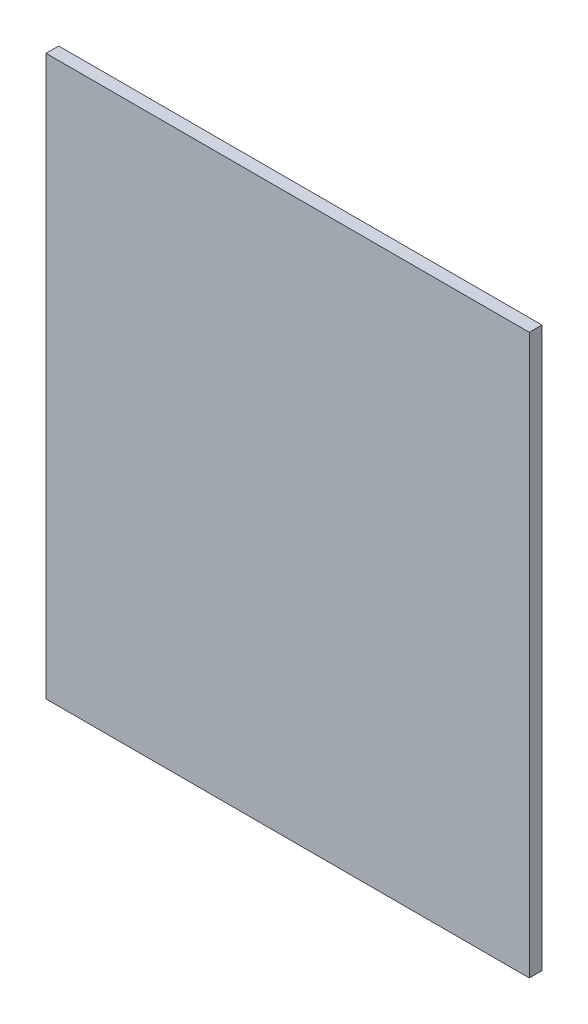
ISO-10303-21;
HEADER;
FILE_DESCRIPTION(('STEP AP214'),'2;1');
FILE_NAME('part.step','',(''),(''),'','','');
FILE_SCHEMA(('AUTOMOTIVE_DESIGN { 1 0 10303 214 1 1 1 1 }'));
ENDSEC;
DATA;
#1=APPLICATION_CONTEXT('core data for automotive mechanical design processes');
#2=APPLICATION_PROTOCOL_DEFINITION('international standard','automotive_design',2000,#1);
#3=PRODUCT_CONTEXT('',#1,'mechanical');
#4=PRODUCT('Part','Part','',(#3));
#5=PRODUCT_RELATED_PRODUCT_CATEGORY('part','',(#4));
#6=PRODUCT_DEFINITION_FORMATION('','',#4);
#7=PRODUCT_DEFINITION_CONTEXT('part definition',#1,'design');
#8=PRODUCT_DEFINITION('design','',#6,#7);
#9=PRODUCT_DEFINITION_SHAPE('','',#8);
#10=(LENGTH_UNIT() NAMED_UNIT(*) SI_UNIT(.MILLI.,.METRE.));
#11=(NAMED_UNIT(*) PLANE_ANGLE_UNIT() SI_UNIT($,.RADIAN.));
#12=(NAMED_UNIT(*) SI_UNIT($,.STERADIAN.) SOLID_ANGLE_UNIT());
#13=UNCERTAINTY_MEASURE_WITH_UNIT(LENGTH_MEASURE(1.E-05),#10,'distance_accuracy_value','');
#14=(GEOMETRIC_REPRESENTATION_CONTEXT(3) GLOBAL_UNCERTAINTY_ASSIGNED_CONTEXT((#13)) GLOBAL_UNIT_ASSIGNED_CONTEXT((#10,
#11,#12)) REPRESENTATION_CONTEXT('',''));
#15=CARTESIAN_POINT('',(0.,0.,0.));
#16=DIRECTION('',(0.,0.,1.));
#17=DIRECTION('',(1.,0.,0.));
#18=AXIS2_PLACEMENT_3D('',#15,#16,#17);
#19=CARTESIAN_POINT('',(95.5,-110.5,5.));
#20=DIRECTION('',(-1.,0.,0.));
#21=DIRECTION('',(0.,0.,1.));
#22=AXIS2_PLACEMENT_3D('',#19,#20,#21);
#23=PLANE('',#22);
#24=DIRECTION('',(0.,1.,0.));
#25=VECTOR('',#24,1.);
#26=CARTESIAN_POINT('',(95.5,-110.5,0.));
#27=LINE('',#26,#25);
#28=CARTESIAN_POINT('',(95.5,-110.5,0.));
#29=VERTEX_POINT('',#28);
#30=CARTESIAN_POINT('',(95.5,110.5,0.));
#31=VERTEX_POINT('',#30);
#32=EDGE_CURVE('E111',#29,#31,#27,.T.);
#33=ORIENTED_EDGE('',*,*,#32,.T.);
#34=DIRECTION('',(0.,0.,-1.));
#35=VECTOR('',#34,1.);
#36=CARTESIAN_POINT('',(95.5,110.5,5.));
#37=LINE('',#36,#35);
#38=CARTESIAN_POINT('',(95.5,110.5,5.));
#39=VERTEX_POINT('',#38);
#40=EDGE_CURVE('E11',#39,#31,#37,.T.);
#41=ORIENTED_EDGE('',*,*,#40,.F.);
#42=DIRECTION('',(0.,1.,0.));
#43=VECTOR('',#42,1.);
#44=CARTESIAN_POINT('',(95.5,-110.5,5.));
#45=LINE('',#44,#43);
#46=CARTESIAN_POINT('',(95.5,-110.5,5.));
#47=VERTEX_POINT('',#46);
#48=EDGE_CURVE('E95',#47,#39,#45,.T.);
#49=ORIENTED_EDGE('',*,*,#48,.F.);
#50=DIRECTION('',(0.,0.,-1.));
#51=VECTOR('',#50,1.);
#52=CARTESIAN_POINT('',(95.5,-110.5,5.));
#53=LINE('',#52,#51);
#54=EDGE_CURVE('E107',#47,#29,#53,.T.);
#55=ORIENTED_EDGE('',*,*,#54,.T.);
#56=EDGE_LOOP('',(#33,#41,#49,#55));
#57=FACE_BOUND('',#56,.T.);
#58=ADVANCED_FACE('F43',(#57),#23,.F.);
#59=CARTESIAN_POINT('',(-95.5,110.5,5.));
#60=DIRECTION('',(0.,-1.,0.));
#61=DIRECTION('',(0.,0.,-1.));
#62=AXIS2_PLACEMENT_3D('',#59,#60,#61);
#63=PLANE('',#62);
#64=DIRECTION('',(-1.,0.,0.));
#65=VECTOR('',#64,1.);
#66=CARTESIAN_POINT('',(-95.5,110.5,0.));
#67=LINE('',#66,#65);
#68=CARTESIAN_POINT('',(-95.5,110.5,0.));
#69=VERTEX_POINT('',#68);
#70=EDGE_CURVE('E100',#31,#69,#67,.T.);
#71=ORIENTED_EDGE('',*,*,#70,.T.);
#72=DIRECTION('',(0.,0.,-1.));
#73=VECTOR('',#72,1.);
#74=CARTESIAN_POINT('',(-95.5,110.5,5.));
#75=LINE('',#74,#73);
#76=CARTESIAN_POINT('',(-95.5,110.5,5.));
#77=VERTEX_POINT('',#76);
#78=EDGE_CURVE('E52',#77,#69,#75,.T.);
#79=ORIENTED_EDGE('',*,*,#78,.F.);
#80=DIRECTION('',(-1.,0.,0.));
#81=VECTOR('',#80,1.);
#82=CARTESIAN_POINT('',(-95.5,110.5,5.));
#83=LINE('',#82,#81);
#84=EDGE_CURVE('E90',#39,#77,#83,.T.);
#85=ORIENTED_EDGE('',*,*,#84,.F.);
#86=ORIENTED_EDGE('',*,*,#40,.T.);
#87=EDGE_LOOP('',(#71,#79,#85,#86));
#88=FACE_BOUND('',#87,.T.);
#89=ADVANCED_FACE('F99',(#88),#63,.F.);
#90=CARTESIAN_POINT('',(-95.5,-110.5,5.));
#91=DIRECTION('',(1.,0.,0.));
#92=DIRECTION('',(0.,0.,-1.));
#93=AXIS2_PLACEMENT_3D('',#90,#91,#92);
#94=PLANE('',#93);
#95=DIRECTION('',(0.,-1.,0.));
#96=VECTOR('',#95,1.);
#97=CARTESIAN_POINT('',(-95.5,-110.5,0.));
#98=LINE('',#97,#96);
#99=CARTESIAN_POINT('',(-95.5,-110.5,0.));
#100=VERTEX_POINT('',#99);
#101=EDGE_CURVE('E77',#69,#100,#98,.T.);
#102=ORIENTED_EDGE('',*,*,#101,.T.);
#103=DIRECTION('',(0.,0.,-1.));
#104=VECTOR('',#103,1.);
#105=CARTESIAN_POINT('',(-95.5,-110.5,5.));
#106=LINE('',#105,#104);
#107=CARTESIAN_POINT('',(-95.5,-110.5,5.));
#108=VERTEX_POINT('',#107);
#109=EDGE_CURVE('E102',#108,#100,#106,.T.);
#110=ORIENTED_EDGE('',*,*,#109,.F.);
#111=DIRECTION('',(0.,-1.,0.));
#112=VECTOR('',#111,1.);
#113=CARTESIAN_POINT('',(-95.5,-110.5,5.));
#114=LINE('',#113,#112);
#115=EDGE_CURVE('E93',#77,#108,#114,.T.);
#116=ORIENTED_EDGE('',*,*,#115,.F.);
#117=ORIENTED_EDGE('',*,*,#78,.T.);
#118=EDGE_LOOP('',(#102,#110,#116,#117));
#119=FACE_BOUND('',#118,.T.);
#120=ADVANCED_FACE('F103',(#119),#94,.F.);
#121=CARTESIAN_POINT('',(-95.5,-110.5,5.));
#122=DIRECTION('',(0.,1.,0.));
#123=DIRECTION('',(0.,0.,1.));
#124=AXIS2_PLACEMENT_3D('',#121,#122,#123);
#125=PLANE('',#124);
#126=DIRECTION('',(1.,0.,0.));
#127=VECTOR('',#126,1.);
#128=CARTESIAN_POINT('',(-95.5,-110.5,0.));
#129=LINE('',#128,#127);
#130=EDGE_CURVE('E83',#100,#29,#129,.T.);
#131=ORIENTED_EDGE('',*,*,#130,.T.);
#132=ORIENTED_EDGE('',*,*,#54,.F.);
#133=DIRECTION('',(1.,0.,0.));
#134=VECTOR('',#133,1.);
#135=CARTESIAN_POINT('',(-95.5,-110.5,5.));
#136=LINE('',#135,#134);
#137=EDGE_CURVE('E60',#108,#47,#136,.T.);
#138=ORIENTED_EDGE('',*,*,#137,.F.);
#139=ORIENTED_EDGE('',*,*,#109,.T.);
#140=EDGE_LOOP('',(#131,#132,#138,#139));
#141=FACE_BOUND('',#140,.T.);
#142=ADVANCED_FACE('F124',(#141),#125,.F.);
#143=CARTESIAN_POINT('',(0.,0.,5.));
#144=DIRECTION('',(0.,0.,-1.));
#145=DIRECTION('',(-1.,0.,0.));
#146=AXIS2_PLACEMENT_3D('',#143,#144,#145);
#147=PLANE('',#146);
#148=ORIENTED_EDGE('',*,*,#48,.T.);
#149=ORIENTED_EDGE('',*,*,#84,.T.);
#150=ORIENTED_EDGE('',*,*,#115,.T.);
#151=ORIENTED_EDGE('',*,*,#137,.T.);
#152=EDGE_LOOP('',(#148,#149,#150,#151));
#153=FACE_BOUND('',#152,.T.);
#154=ADVANCED_FACE('F91',(#153),#147,.F.);
#155=CARTESIAN_POINT('',(0.,0.,0.));
#156=DIRECTION('',(0.,0.,-1.));
#157=DIRECTION('',(-1.,0.,0.));
#158=AXIS2_PLACEMENT_3D('',#155,#156,#157);
#159=PLANE('',#158);
#160=ORIENTED_EDGE('',*,*,#32,.F.);
#161=ORIENTED_EDGE('',*,*,#130,.F.);
#162=ORIENTED_EDGE('',*,*,#101,.F.);
#163=ORIENTED_EDGE('',*,*,#70,.F.);
#164=EDGE_LOOP('',(#160,#161,#162,#163));
#165=FACE_BOUND('',#164,.T.);
#166=ADVANCED_FACE('F127',(#165),#159,.T.);
#167=CLOSED_SHELL('',(#58,#89,#120,#142,#154,#166));
#168=MANIFOLD_SOLID_BREP('B2',#167);
#169=ADVANCED_BREP_SHAPE_REPRESENTATION('',(#18,#168),#14);
#170=SHAPE_DEFINITION_REPRESENTATION(#9,#169);
ENDSEC;
END-ISO-10303-21;
